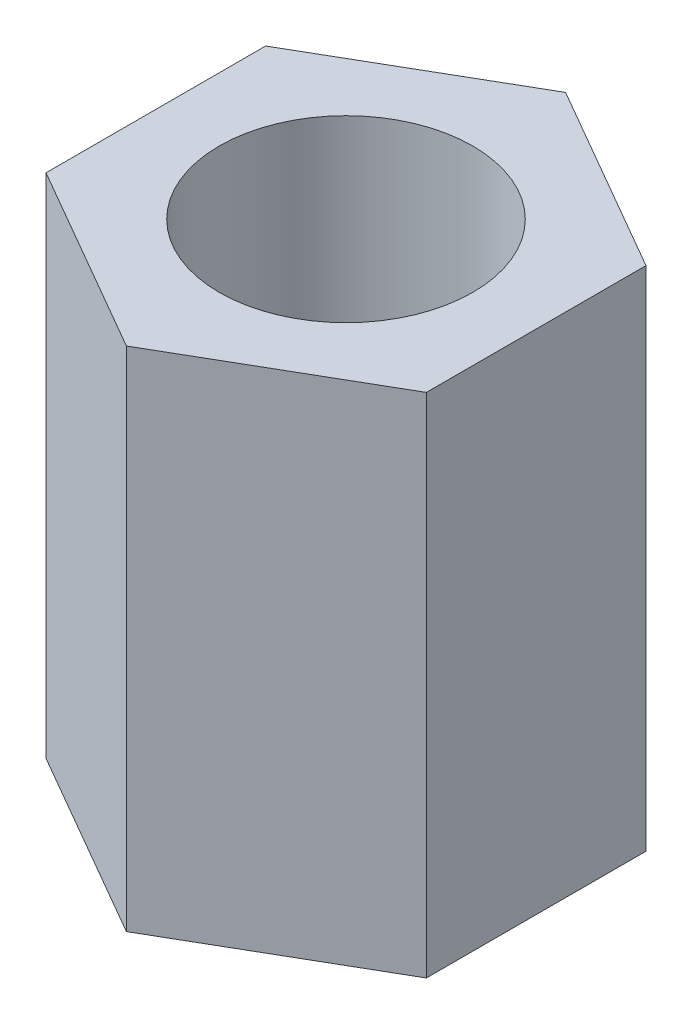
ISO-10303-21;
HEADER;
FILE_DESCRIPTION(('STEP AP214'),'2;1');
FILE_NAME('part.step','',(''),(''),'','','');
FILE_SCHEMA(('AUTOMOTIVE_DESIGN { 1 0 10303 214 1 1 1 1 }'));
ENDSEC;
DATA;
#1=APPLICATION_CONTEXT('core data for automotive mechanical design processes');
#2=APPLICATION_PROTOCOL_DEFINITION('international standard','automotive_design',2000,#1);
#3=PRODUCT_CONTEXT('',#1,'mechanical');
#4=PRODUCT('Part','Part','',(#3));
#5=PRODUCT_RELATED_PRODUCT_CATEGORY('part','',(#4));
#6=PRODUCT_DEFINITION_FORMATION('','',#4);
#7=PRODUCT_DEFINITION_CONTEXT('part definition',#1,'design');
#8=PRODUCT_DEFINITION('design','',#6,#7);
#9=PRODUCT_DEFINITION_SHAPE('','',#8);
#10=(LENGTH_UNIT() NAMED_UNIT(*) SI_UNIT(.MILLI.,.METRE.));
#11=(NAMED_UNIT(*) PLANE_ANGLE_UNIT() SI_UNIT($,.RADIAN.));
#12=(NAMED_UNIT(*) SI_UNIT($,.STERADIAN.) SOLID_ANGLE_UNIT());
#13=UNCERTAINTY_MEASURE_WITH_UNIT(LENGTH_MEASURE(1.E-05),#10,'distance_accuracy_value','');
#14=(GEOMETRIC_REPRESENTATION_CONTEXT(3) GLOBAL_UNCERTAINTY_ASSIGNED_CONTEXT((#13)) GLOBAL_UNIT_ASSIGNED_CONTEXT((#10,
#11,#12)) REPRESENTATION_CONTEXT('',''));
#15=CARTESIAN_POINT('',(0.,0.,0.));
#16=DIRECTION('',(0.,0.,1.));
#17=DIRECTION('',(1.,0.,0.));
#18=AXIS2_PLACEMENT_3D('',#15,#16,#17);
#19=CARTESIAN_POINT('',(2.24999999999998,6.,-1.29903810567668));
#20=DIRECTION('',(-0.499999999999995,0.,0.866025403784442));
#21=DIRECTION('',(0.866025403784442,0.,0.499999999999995));
#22=AXIS2_PLACEMENT_3D('',#19,#20,#21);
#23=PLANE('',#22);
#24=DIRECTION('',(-0.866025403784441,0.,-0.499999999999995));
#25=VECTOR('',#24,1.);
#26=CARTESIAN_POINT('',(2.24999999999998,0.,-1.29903810567668));
#27=LINE('',#26,#25);
#28=CARTESIAN_POINT('',(2.24999999999998,0.,-1.29903810567668));
#29=VERTEX_POINT('',#28);
#30=CARTESIAN_POINT('',(0.,0.,-2.59807621135331));
#31=VERTEX_POINT('',#30);
#32=EDGE_CURVE('E117',#29,#31,#27,.T.);
#33=ORIENTED_EDGE('',*,*,#32,.T.);
#34=DIRECTION('',(0.,-1.,0.));
#35=VECTOR('',#34,1.);
#36=CARTESIAN_POINT('',(0.,6.,-2.59807621135331));
#37=LINE('',#36,#35);
#38=CARTESIAN_POINT('',(0.,6.,-2.59807621135331));
#39=VERTEX_POINT('',#38);
#40=EDGE_CURVE('E11',#39,#31,#37,.T.);
#41=ORIENTED_EDGE('',*,*,#40,.F.);
#42=DIRECTION('',(-0.866025403784441,0.,-0.499999999999995));
#43=VECTOR('',#42,1.);
#44=CARTESIAN_POINT('',(2.24999999999998,6.,-1.29903810567668));
#45=LINE('',#44,#43);
#46=CARTESIAN_POINT('',(2.24999999999998,6.,-1.29903810567668));
#47=VERTEX_POINT('',#46);
#48=EDGE_CURVE('E127',#47,#39,#45,.T.);
#49=ORIENTED_EDGE('',*,*,#48,.F.);
#50=DIRECTION('',(0.,-1.,0.));
#51=VECTOR('',#50,1.);
#52=CARTESIAN_POINT('',(2.24999999999998,6.,-1.29903810567668));
#53=LINE('',#52,#51);
#54=EDGE_CURVE('E113',#47,#29,#53,.T.);
#55=ORIENTED_EDGE('',*,*,#54,.T.);
#56=EDGE_LOOP('',(#33,#41,#49,#55));
#57=FACE_BOUND('',#56,.T.);
#58=ADVANCED_FACE('F32',(#57),#23,.F.);
#59=CARTESIAN_POINT('',(0.,6.,-2.59807621135331));
#60=DIRECTION('',(0.500000000000001,0.,0.866025403784438));
#61=DIRECTION('',(0.866025403784438,0.,-0.500000000000001));
#62=AXIS2_PLACEMENT_3D('',#59,#60,#61);
#63=PLANE('',#62);
#64=DIRECTION('',(-0.866025403784438,0.,0.500000000000001));
#65=VECTOR('',#64,1.);
#66=CARTESIAN_POINT('',(0.,0.,-2.59807621135331));
#67=LINE('',#66,#65);
#68=CARTESIAN_POINT('',(-2.25,0.,-1.29903810567665));
#69=VERTEX_POINT('',#68);
#70=EDGE_CURVE('E120',#31,#69,#67,.T.);
#71=ORIENTED_EDGE('',*,*,#70,.T.);
#72=DIRECTION('',(0.,-1.,0.));
#73=VECTOR('',#72,1.);
#74=CARTESIAN_POINT('',(-2.25,6.,-1.29903810567665));
#75=LINE('',#74,#73);
#76=CARTESIAN_POINT('',(-2.25,6.,-1.29903810567665));
#77=VERTEX_POINT('',#76);
#78=EDGE_CURVE('E41',#77,#69,#75,.T.);
#79=ORIENTED_EDGE('',*,*,#78,.F.);
#80=DIRECTION('',(-0.866025403784438,0.,0.500000000000001));
#81=VECTOR('',#80,1.);
#82=CARTESIAN_POINT('',(0.,6.,-2.59807621135331));
#83=LINE('',#82,#81);
#84=EDGE_CURVE('E86',#39,#77,#83,.T.);
#85=ORIENTED_EDGE('',*,*,#84,.F.);
#86=ORIENTED_EDGE('',*,*,#40,.T.);
#87=EDGE_LOOP('',(#71,#79,#85,#86));
#88=FACE_BOUND('',#87,.T.);
#89=ADVANCED_FACE('F153',(#88),#63,.F.);
#90=CARTESIAN_POINT('',(-2.25,6.,-1.29903810567665));
#91=DIRECTION('',(1.,0.,0.));
#92=DIRECTION('',(0.,0.,-1.));
#93=AXIS2_PLACEMENT_3D('',#90,#91,#92);
#94=PLANE('',#93);
#95=DIRECTION('',(0.,0.,1.));
#96=VECTOR('',#95,1.);
#97=CARTESIAN_POINT('',(-2.25,0.,-1.29903810567665));
#98=LINE('',#97,#96);
#99=CARTESIAN_POINT('',(-2.24999999999999,0.,1.29903810567667));
#100=VERTEX_POINT('',#99);
#101=EDGE_CURVE('E122',#69,#100,#98,.T.);
#102=ORIENTED_EDGE('',*,*,#101,.T.);
#103=DIRECTION('',(0.,-1.,0.));
#104=VECTOR('',#103,1.);
#105=CARTESIAN_POINT('',(-2.24999999999999,6.,1.29903810567667));
#106=LINE('',#105,#104);
#107=CARTESIAN_POINT('',(-2.24999999999999,6.,1.29903810567667));
#108=VERTEX_POINT('',#107);
#109=EDGE_CURVE('E108',#108,#100,#106,.T.);
#110=ORIENTED_EDGE('',*,*,#109,.F.);
#111=DIRECTION('',(0.,0.,1.));
#112=VECTOR('',#111,1.);
#113=CARTESIAN_POINT('',(-2.25,6.,-1.29903810567665));
#114=LINE('',#113,#112);
#115=EDGE_CURVE('E99',#77,#108,#114,.T.);
#116=ORIENTED_EDGE('',*,*,#115,.F.);
#117=ORIENTED_EDGE('',*,*,#78,.T.);
#118=EDGE_LOOP('',(#102,#110,#116,#117));
#119=FACE_BOUND('',#118,.T.);
#120=ADVANCED_FACE('F134',(#119),#94,.F.);
#121=CARTESIAN_POINT('',(-2.24999999999999,6.,1.29903810567667));
#122=DIRECTION('',(0.499999999999995,0.,-0.866025403784441));
#123=DIRECTION('',(-0.866025403784441,0.,-0.499999999999995));
#124=AXIS2_PLACEMENT_3D('',#121,#122,#123);
#125=PLANE('',#124);
#126=DIRECTION('',(0.866025403784441,0.,0.499999999999995));
#127=VECTOR('',#126,1.);
#128=CARTESIAN_POINT('',(-2.24999999999999,0.,1.29903810567667));
#129=LINE('',#128,#127);
#130=CARTESIAN_POINT('',(0.,0.,2.59807621135331));
#131=VERTEX_POINT('',#130);
#132=EDGE_CURVE('E107',#100,#131,#129,.T.);
#133=ORIENTED_EDGE('',*,*,#132,.T.);
#134=DIRECTION('',(0.,-1.,0.));
#135=VECTOR('',#134,1.);
#136=CARTESIAN_POINT('',(0.,6.,2.59807621135331));
#137=LINE('',#136,#135);
#138=CARTESIAN_POINT('',(0.,6.,2.59807621135331));
#139=VERTEX_POINT('',#138);
#140=EDGE_CURVE('E104',#139,#131,#137,.T.);
#141=ORIENTED_EDGE('',*,*,#140,.F.);
#142=DIRECTION('',(0.866025403784441,0.,0.499999999999995));
#143=VECTOR('',#142,1.);
#144=CARTESIAN_POINT('',(-2.24999999999999,6.,1.29903810567667));
#145=LINE('',#144,#143);
#146=EDGE_CURVE('E93',#108,#139,#145,.T.);
#147=ORIENTED_EDGE('',*,*,#146,.F.);
#148=ORIENTED_EDGE('',*,*,#109,.T.);
#149=EDGE_LOOP('',(#133,#141,#147,#148));
#150=FACE_BOUND('',#149,.T.);
#151=ADVANCED_FACE('F105',(#150),#125,.F.);
#152=CARTESIAN_POINT('',(0.,6.,2.59807621135331));
#153=DIRECTION('',(-0.500000000000007,0.,-0.866025403784434));
#154=DIRECTION('',(-0.866025403784435,0.,0.500000000000007));
#155=AXIS2_PLACEMENT_3D('',#152,#153,#154);
#156=PLANE('',#155);
#157=DIRECTION('',(0.866025403784434,0.,-0.500000000000007));
#158=VECTOR('',#157,1.);
#159=CARTESIAN_POINT('',(0.,0.,2.59807621135331));
#160=LINE('',#159,#158);
#161=CARTESIAN_POINT('',(2.25000000000001,0.,1.29903810567663));
#162=VERTEX_POINT('',#161);
#163=EDGE_CURVE('E72',#131,#162,#160,.T.);
#164=ORIENTED_EDGE('',*,*,#163,.T.);
#165=DIRECTION('',(0.,-1.,0.));
#166=VECTOR('',#165,1.);
#167=CARTESIAN_POINT('',(2.25000000000001,6.,1.29903810567663));
#168=LINE('',#167,#166);
#169=CARTESIAN_POINT('',(2.25000000000001,6.,1.29903810567663));
#170=VERTEX_POINT('',#169);
#171=EDGE_CURVE('E109',#170,#162,#168,.T.);
#172=ORIENTED_EDGE('',*,*,#171,.F.);
#173=DIRECTION('',(0.866025403784434,0.,-0.500000000000007));
#174=VECTOR('',#173,1.);
#175=CARTESIAN_POINT('',(0.,6.,2.59807621135331));
#176=LINE('',#175,#174);
#177=EDGE_CURVE('E97',#139,#170,#176,.T.);
#178=ORIENTED_EDGE('',*,*,#177,.F.);
#179=ORIENTED_EDGE('',*,*,#140,.T.);
#180=EDGE_LOOP('',(#164,#172,#178,#179));
#181=FACE_BOUND('',#180,.T.);
#182=ADVANCED_FACE('F111',(#181),#156,.F.);
#183=CARTESIAN_POINT('',(2.25000000000001,6.,1.29903810567663));
#184=DIRECTION('',(-1.,0.,0.));
#185=DIRECTION('',(0.,0.,1.));
#186=AXIS2_PLACEMENT_3D('',#183,#184,#185);
#187=PLANE('',#186);
#188=DIRECTION('',(0.,0.,-1.));
#189=VECTOR('',#188,1.);
#190=CARTESIAN_POINT('',(2.25000000000001,0.,1.29903810567663));
#191=LINE('',#190,#189);
#192=EDGE_CURVE('E78',#162,#29,#191,.T.);
#193=ORIENTED_EDGE('',*,*,#192,.T.);
#194=ORIENTED_EDGE('',*,*,#54,.F.);
#195=DIRECTION('',(0.,0.,-1.));
#196=VECTOR('',#195,1.);
#197=CARTESIAN_POINT('',(2.25000000000001,6.,1.29903810567663));
#198=LINE('',#197,#196);
#199=EDGE_CURVE('E49',#170,#47,#198,.T.);
#200=ORIENTED_EDGE('',*,*,#199,.F.);
#201=ORIENTED_EDGE('',*,*,#171,.T.);
#202=EDGE_LOOP('',(#193,#194,#200,#201));
#203=FACE_BOUND('',#202,.T.);
#204=ADVANCED_FACE('F141',(#203),#187,.F.);
#205=CARTESIAN_POINT('',(0.,6.,0.));
#206=DIRECTION('',(0.,1.,0.));
#207=DIRECTION('',(0.,0.,1.));
#208=AXIS2_PLACEMENT_3D('',#205,#206,#207);
#209=PLANE('',#208);
#210=CARTESIAN_POINT('',(0.,6.,0.));
#211=DIRECTION('',(0.,1.,0.));
#212=DIRECTION('',(0.,0.,1.));
#213=AXIS2_PLACEMENT_3D('',#210,#211,#212);
#214=CIRCLE('',#213,1.5);
#215=CARTESIAN_POINT('',(0.,6.,1.5));
#216=VERTEX_POINT('',#215);
#217=EDGE_CURVE('E206',#216,#216,#214,.T.);
#218=ORIENTED_EDGE('',*,*,#217,.F.);
#219=EDGE_LOOP('',(#218));
#220=FACE_BOUND('',#219,.T.);
#221=ORIENTED_EDGE('',*,*,#48,.T.);
#222=ORIENTED_EDGE('',*,*,#84,.T.);
#223=ORIENTED_EDGE('',*,*,#115,.T.);
#224=ORIENTED_EDGE('',*,*,#146,.T.);
#225=ORIENTED_EDGE('',*,*,#177,.T.);
#226=ORIENTED_EDGE('',*,*,#199,.T.);
#227=EDGE_LOOP('',(#221,#222,#223,#224,#225,#226));
#228=FACE_BOUND('',#227,.T.);
#229=ADVANCED_FACE('F95',(#220,#228),#209,.T.);
#230=CARTESIAN_POINT('',(0.,0.,0.));
#231=DIRECTION('',(0.,1.,0.));
#232=DIRECTION('',(0.,0.,1.));
#233=AXIS2_PLACEMENT_3D('',#230,#231,#232);
#234=PLANE('',#233);
#235=CARTESIAN_POINT('',(0.,0.,0.));
#236=DIRECTION('',(0.,1.,0.));
#237=DIRECTION('',(0.,0.,1.));
#238=AXIS2_PLACEMENT_3D('',#235,#236,#237);
#239=CIRCLE('',#238,1.5);
#240=CARTESIAN_POINT('',(0.,0.,1.5));
#241=VERTEX_POINT('',#240);
#242=EDGE_CURVE('E35',#241,#241,#239,.T.);
#243=ORIENTED_EDGE('',*,*,#242,.T.);
#244=EDGE_LOOP('',(#243));
#245=FACE_BOUND('',#244,.T.);
#246=ORIENTED_EDGE('',*,*,#32,.F.);
#247=ORIENTED_EDGE('',*,*,#192,.F.);
#248=ORIENTED_EDGE('',*,*,#163,.F.);
#249=ORIENTED_EDGE('',*,*,#132,.F.);
#250=ORIENTED_EDGE('',*,*,#101,.F.);
#251=ORIENTED_EDGE('',*,*,#70,.F.);
#252=EDGE_LOOP('',(#246,#247,#248,#249,#250,#251));
#253=FACE_BOUND('',#252,.T.);
#254=ADVANCED_FACE('F137',(#245,#253),#234,.F.);
#255=CARTESIAN_POINT('',(0.,-19.,0.));
#256=DIRECTION('',(0.,1.,0.));
#257=DIRECTION('',(0.,0.,1.));
#258=AXIS2_PLACEMENT_3D('',#255,#256,#257);
#259=CYLINDRICAL_SURFACE('',#258,1.5);
#260=ORIENTED_EDGE('',*,*,#217,.T.);
#261=EDGE_LOOP('',(#260));
#262=FACE_BOUND('',#261,.T.);
#263=ORIENTED_EDGE('',*,*,#242,.F.);
#264=EDGE_LOOP('',(#263));
#265=FACE_BOUND('',#264,.T.);
#266=ADVANCED_FACE('F190',(#262,#265),#259,.F.);
#267=CLOSED_SHELL('',(#58,#89,#120,#151,#182,#204,#229,#254,#266));
#268=MANIFOLD_SOLID_BREP('B2',#267);
#269=ADVANCED_BREP_SHAPE_REPRESENTATION('',(#18,#268),#14);
#270=SHAPE_DEFINITION_REPRESENTATION(#9,#269);
ENDSEC;
END-ISO-10303-21;
